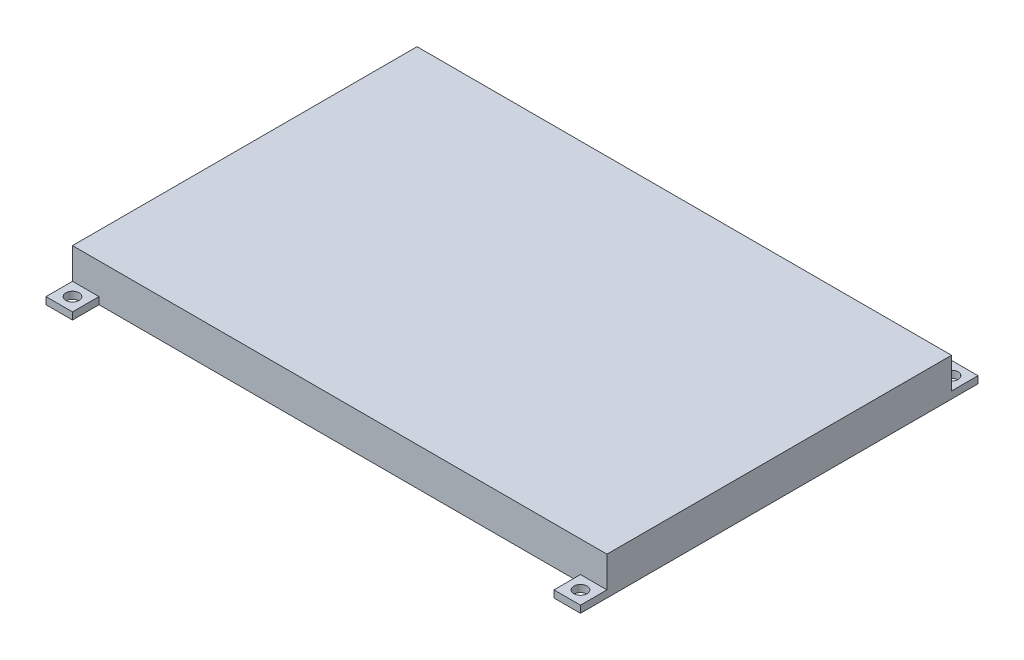
ISO-10303-21;
HEADER;
FILE_DESCRIPTION(('STEP AP214'),'2;1');
FILE_NAME('part.step','',(''),(''),'','','');
FILE_SCHEMA(('AUTOMOTIVE_DESIGN { 1 0 10303 214 1 1 1 1 }'));
ENDSEC;
DATA;
#1=APPLICATION_CONTEXT('core data for automotive mechanical design processes');
#2=APPLICATION_PROTOCOL_DEFINITION('international standard','automotive_design',2000,#1);
#3=PRODUCT_CONTEXT('',#1,'mechanical');
#4=PRODUCT('Part','Part','',(#3));
#5=PRODUCT_RELATED_PRODUCT_CATEGORY('part','',(#4));
#6=PRODUCT_DEFINITION_FORMATION('','',#4);
#7=PRODUCT_DEFINITION_CONTEXT('part definition',#1,'design');
#8=PRODUCT_DEFINITION('design','',#6,#7);
#9=PRODUCT_DEFINITION_SHAPE('','',#8);
#10=(LENGTH_UNIT() NAMED_UNIT(*) SI_UNIT(.MILLI.,.METRE.));
#11=(NAMED_UNIT(*) PLANE_ANGLE_UNIT() SI_UNIT($,.RADIAN.));
#12=(NAMED_UNIT(*) SI_UNIT($,.STERADIAN.) SOLID_ANGLE_UNIT());
#13=UNCERTAINTY_MEASURE_WITH_UNIT(LENGTH_MEASURE(1.E-05),#10,'distance_accuracy_value','');
#14=(GEOMETRIC_REPRESENTATION_CONTEXT(3) GLOBAL_UNCERTAINTY_ASSIGNED_CONTEXT((#13)) GLOBAL_UNIT_ASSIGNED_CONTEXT((#10,
#11,#12)) REPRESENTATION_CONTEXT('',''));
#15=CARTESIAN_POINT('',(0.,0.,0.));
#16=DIRECTION('',(0.,0.,1.));
#17=DIRECTION('',(1.,0.,0.));
#18=AXIS2_PLACEMENT_3D('',#15,#16,#17);
#19=CARTESIAN_POINT('',(0.,1.6,0.));
#20=DIRECTION('',(0.,-1.,0.));
#21=DIRECTION('',(0.,0.,-1.));
#22=AXIS2_PLACEMENT_3D('',#19,#20,#21);
#23=PLANE('',#22);
#24=CARTESIAN_POINT('',(-48.8422609717869,1.6,-61.1950025864503));
#25=DIRECTION('',(0.,1.,0.));
#26=DIRECTION('',(0.,0.,-1.));
#27=AXIS2_PLACEMENT_3D('',#24,#25,#26);
#28=CIRCLE('',#27,1.5);
#29=CARTESIAN_POINT('',(-48.8422609717869,1.6,-62.6950025864503));
#30=VERTEX_POINT('',#29);
#31=EDGE_CURVE('E190',#30,#30,#28,.T.);
#32=ORIENTED_EDGE('',*,*,#31,.F.);
#33=EDGE_LOOP('',(#32));
#34=FACE_BOUND('',#33,.T.);
#35=DIRECTION('',(-1.,0.,0.));
#36=VECTOR('',#35,1.);
#37=CARTESIAN_POINT('',(-166.842260971787,1.6,-58.1950025864503));
#38=LINE('',#37,#36);
#39=CARTESIAN_POINT('',(-45.8422609717865,1.6,-58.1950025864503));
#40=VERTEX_POINT('',#39);
#41=CARTESIAN_POINT('',(-51.8422609717869,1.6,-58.1950025864503));
#42=VERTEX_POINT('',#41);
#43=EDGE_CURVE('E44',#40,#42,#38,.T.);
#44=ORIENTED_EDGE('',*,*,#43,.F.);
#45=DIRECTION('',(0.,0.,-1.));
#46=VECTOR('',#45,1.);
#47=CARTESIAN_POINT('',(-45.8422609717869,1.6,19.8049974135498));
#48=LINE('',#47,#46);
#49=CARTESIAN_POINT('',(-45.8422609717869,1.6,-64.1950025864503));
#50=VERTEX_POINT('',#49);
#51=EDGE_CURVE('E205',#40,#50,#48,.T.);
#52=ORIENTED_EDGE('',*,*,#51,.T.);
#53=DIRECTION('',(-1.,0.,0.));
#54=VECTOR('',#53,1.);
#55=CARTESIAN_POINT('',(-51.8422609717869,1.6,-64.1950025864503));
#56=LINE('',#55,#54);
#57=CARTESIAN_POINT('',(-51.8422609717869,1.6,-64.1950025864503));
#58=VERTEX_POINT('',#57);
#59=EDGE_CURVE('E204',#50,#58,#56,.T.);
#60=ORIENTED_EDGE('',*,*,#59,.T.);
#61=DIRECTION('',(0.,0.,1.));
#62=VECTOR('',#61,1.);
#63=CARTESIAN_POINT('',(-51.8422609717869,1.6,-58.1950025864503));
#64=LINE('',#63,#62);
#65=EDGE_CURVE('E207',#58,#42,#64,.T.);
#66=ORIENTED_EDGE('',*,*,#65,.T.);
#67=EDGE_LOOP('',(#44,#52,#60,#66));
#68=FACE_BOUND('',#67,.T.);
#69=ADVANCED_FACE('F33',(#34,#68),#23,.F.);
#70=CARTESIAN_POINT('',(-163.842260971787,1.6,-61.1950025864502));
#71=DIRECTION('',(0.,1.,0.));
#72=DIRECTION('',(0.,0.,-1.));
#73=AXIS2_PLACEMENT_3D('',#70,#71,#72);
#74=CIRCLE('',#73,1.5);
#75=CARTESIAN_POINT('',(-163.842260971787,1.6,-62.6950025864502));
#76=VERTEX_POINT('',#75);
#77=EDGE_CURVE('E175',#76,#76,#74,.T.);
#78=ORIENTED_EDGE('',*,*,#77,.F.);
#79=EDGE_LOOP('',(#78));
#80=FACE_BOUND('',#79,.T.);
#81=CARTESIAN_POINT('',(-160.842260971787,1.6,-58.1950025864502));
#82=VERTEX_POINT('',#81);
#83=CARTESIAN_POINT('',(-166.842260971787,1.6,-58.1950025864503));
#84=VERTEX_POINT('',#83);
#85=EDGE_CURVE('E11',#82,#84,#38,.T.);
#86=ORIENTED_EDGE('',*,*,#85,.F.);
#87=DIRECTION('',(0.,0.,-1.));
#88=VECTOR('',#87,1.);
#89=CARTESIAN_POINT('',(-160.842260971787,1.6,-64.1950025864502));
#90=LINE('',#89,#88);
#91=CARTESIAN_POINT('',(-160.842260971787,1.6,-64.1950025864502));
#92=VERTEX_POINT('',#91);
#93=EDGE_CURVE('E209',#82,#92,#90,.T.);
#94=ORIENTED_EDGE('',*,*,#93,.T.);
#95=DIRECTION('',(-1.,0.,0.));
#96=VECTOR('',#95,1.);
#97=CARTESIAN_POINT('',(-166.842260971787,1.6,-64.1950025864502));
#98=LINE('',#97,#96);
#99=CARTESIAN_POINT('',(-166.842260971787,1.6,-64.1950025864502));
#100=VERTEX_POINT('',#99);
#101=EDGE_CURVE('E211',#92,#100,#98,.T.);
#102=ORIENTED_EDGE('',*,*,#101,.T.);
#103=DIRECTION('',(0.,0.,1.));
#104=VECTOR('',#103,1.);
#105=CARTESIAN_POINT('',(-166.842260971787,1.6,-58.1950025864503));
#106=LINE('',#105,#104);
#107=EDGE_CURVE('E59',#100,#84,#106,.T.);
#108=ORIENTED_EDGE('',*,*,#107,.T.);
#109=EDGE_LOOP('',(#86,#94,#102,#108));
#110=FACE_BOUND('',#109,.T.);
#111=ADVANCED_FACE('F317',(#80,#110),#23,.F.);
#112=CARTESIAN_POINT('',(-163.842260971787,1.6,22.8049974135498));
#113=DIRECTION('',(0.,1.,0.));
#114=DIRECTION('',(0.,0.,1.));
#115=AXIS2_PLACEMENT_3D('',#112,#113,#114);
#116=CIRCLE('',#115,1.5);
#117=CARTESIAN_POINT('',(-163.842260971787,1.6,24.3049974135498));
#118=VERTEX_POINT('',#117);
#119=EDGE_CURVE('E196',#118,#118,#116,.T.);
#120=ORIENTED_EDGE('',*,*,#119,.F.);
#121=EDGE_LOOP('',(#120));
#122=FACE_BOUND('',#121,.T.);
#123=DIRECTION('',(1.,0.,0.));
#124=VECTOR('',#123,1.);
#125=CARTESIAN_POINT('',(-166.842260971787,1.6,19.8049974135497));
#126=LINE('',#125,#124);
#127=CARTESIAN_POINT('',(-166.842260971787,1.6,19.8049974135497));
#128=VERTEX_POINT('',#127);
#129=CARTESIAN_POINT('',(-160.842260971787,1.6,19.8049974135497));
#130=VERTEX_POINT('',#129);
#131=EDGE_CURVE('E51',#128,#130,#126,.T.);
#132=ORIENTED_EDGE('',*,*,#131,.F.);
#133=CARTESIAN_POINT('',(-166.842260971787,1.6,25.8049974135497));
#134=VERTEX_POINT('',#133);
#135=EDGE_CURVE('E171',#128,#134,#106,.T.);
#136=ORIENTED_EDGE('',*,*,#135,.T.);
#137=DIRECTION('',(1.,0.,0.));
#138=VECTOR('',#137,1.);
#139=CARTESIAN_POINT('',(-160.842260971787,1.6,25.8049974135497));
#140=LINE('',#139,#138);
#141=CARTESIAN_POINT('',(-160.842260971787,1.6,25.8049974135497));
#142=VERTEX_POINT('',#141);
#143=EDGE_CURVE('E214',#134,#142,#140,.T.);
#144=ORIENTED_EDGE('',*,*,#143,.T.);
#145=DIRECTION('',(0.,0.,-1.));
#146=VECTOR('',#145,1.);
#147=CARTESIAN_POINT('',(-160.842260971787,1.6,19.8049974135497));
#148=LINE('',#147,#146);
#149=EDGE_CURVE('E216',#142,#130,#148,.T.);
#150=ORIENTED_EDGE('',*,*,#149,.T.);
#151=EDGE_LOOP('',(#132,#136,#144,#150));
#152=FACE_BOUND('',#151,.T.);
#153=ADVANCED_FACE('F343',(#122,#152),#23,.F.);
#154=CARTESIAN_POINT('',(-48.8422609717869,1.6,22.8049974135497));
#155=DIRECTION('',(0.,1.,0.));
#156=DIRECTION('',(0.,0.,1.));
#157=AXIS2_PLACEMENT_3D('',#154,#155,#156);
#158=CIRCLE('',#157,1.5);
#159=CARTESIAN_POINT('',(-48.8422609717869,1.6,24.3049974135497));
#160=VERTEX_POINT('',#159);
#161=EDGE_CURVE('E184',#160,#160,#158,.T.);
#162=ORIENTED_EDGE('',*,*,#161,.F.);
#163=EDGE_LOOP('',(#162));
#164=FACE_BOUND('',#163,.T.);
#165=CARTESIAN_POINT('',(-51.8422609717869,1.6,19.8049974135497));
#166=VERTEX_POINT('',#165);
#167=CARTESIAN_POINT('',(-45.8422609717869,1.6,19.8049974135497));
#168=VERTEX_POINT('',#167);
#169=EDGE_CURVE('E42',#166,#168,#126,.T.);
#170=ORIENTED_EDGE('',*,*,#169,.F.);
#171=DIRECTION('',(0.,0.,1.));
#172=VECTOR('',#171,1.);
#173=CARTESIAN_POINT('',(-51.8422609717869,1.6,25.8049974135497));
#174=LINE('',#173,#172);
#175=CARTESIAN_POINT('',(-51.8422609717869,1.6,25.8049974135497));
#176=VERTEX_POINT('',#175);
#177=EDGE_CURVE('E218',#166,#176,#174,.T.);
#178=ORIENTED_EDGE('',*,*,#177,.T.);
#179=DIRECTION('',(1.,0.,0.));
#180=VECTOR('',#179,1.);
#181=CARTESIAN_POINT('',(-45.8422609717869,1.6,25.8049974135497));
#182=LINE('',#181,#180);
#183=CARTESIAN_POINT('',(-45.8422609717869,1.6,25.8049974135497));
#184=VERTEX_POINT('',#183);
#185=EDGE_CURVE('E220',#176,#184,#182,.T.);
#186=ORIENTED_EDGE('',*,*,#185,.T.);
#187=EDGE_CURVE('E202',#184,#168,#48,.T.);
#188=ORIENTED_EDGE('',*,*,#187,.T.);
#189=EDGE_LOOP('',(#170,#178,#186,#188));
#190=FACE_BOUND('',#189,.T.);
#191=ADVANCED_FACE('F341',(#164,#190),#23,.F.);
#192=CARTESIAN_POINT('',(0.,0.,0.));
#193=DIRECTION('',(0.,-1.,0.));
#194=DIRECTION('',(0.,0.,-1.));
#195=AXIS2_PLACEMENT_3D('',#192,#193,#194);
#196=PLANE('',#195);
#197=CARTESIAN_POINT('',(-48.8422609717869,0.,22.8049974135497));
#198=DIRECTION('',(0.,1.,0.));
#199=DIRECTION('',(0.,0.,1.));
#200=AXIS2_PLACEMENT_3D('',#197,#198,#199);
#201=CIRCLE('',#200,1.5);
#202=CARTESIAN_POINT('',(-48.8422609717869,0.,24.3049974135497));
#203=VERTEX_POINT('',#202);
#204=EDGE_CURVE('E182',#203,#203,#201,.T.);
#205=ORIENTED_EDGE('',*,*,#204,.T.);
#206=EDGE_LOOP('',(#205));
#207=FACE_BOUND('',#206,.T.);
#208=CARTESIAN_POINT('',(-163.842260971787,0.,22.8049974135498));
#209=DIRECTION('',(0.,1.,0.));
#210=DIRECTION('',(0.,0.,1.));
#211=AXIS2_PLACEMENT_3D('',#208,#209,#210);
#212=CIRCLE('',#211,1.5);
#213=CARTESIAN_POINT('',(-163.842260971787,0.,24.3049974135498));
#214=VERTEX_POINT('',#213);
#215=EDGE_CURVE('E193',#214,#214,#212,.T.);
#216=ORIENTED_EDGE('',*,*,#215,.T.);
#217=EDGE_LOOP('',(#216));
#218=FACE_BOUND('',#217,.T.);
#219=DIRECTION('',(0.,0.,-1.));
#220=VECTOR('',#219,1.);
#221=CARTESIAN_POINT('',(-45.8422609717869,0.,-64.1950025864503));
#222=LINE('',#221,#220);
#223=CARTESIAN_POINT('',(-45.8422609717869,0.,25.8049974135497));
#224=VERTEX_POINT('',#223);
#225=CARTESIAN_POINT('',(-45.8422609717869,0.,-64.1950025864503));
#226=VERTEX_POINT('',#225);
#227=EDGE_CURVE('E199',#224,#226,#222,.T.);
#228=ORIENTED_EDGE('',*,*,#227,.F.);
#229=DIRECTION('',(1.,0.,0.));
#230=VECTOR('',#229,1.);
#231=CARTESIAN_POINT('',(-45.8422609717869,0.,25.8049974135497));
#232=LINE('',#231,#230);
#233=CARTESIAN_POINT('',(-51.8422609717869,0.,25.8049974135497));
#234=VERTEX_POINT('',#233);
#235=EDGE_CURVE('E245',#234,#224,#232,.T.);
#236=ORIENTED_EDGE('',*,*,#235,.F.);
#237=DIRECTION('',(0.,0.,1.));
#238=VECTOR('',#237,1.);
#239=CARTESIAN_POINT('',(-51.8422609717869,0.,25.8049974135497));
#240=LINE('',#239,#238);
#241=CARTESIAN_POINT('',(-51.8422609717869,0.,19.8049974135497));
#242=VERTEX_POINT('',#241);
#243=EDGE_CURVE('E243',#242,#234,#240,.T.);
#244=ORIENTED_EDGE('',*,*,#243,.F.);
#245=DIRECTION('',(1.,0.,0.));
#246=VECTOR('',#245,1.);
#247=CARTESIAN_POINT('',(-51.8422609717869,0.,19.8049974135497));
#248=LINE('',#247,#246);
#249=CARTESIAN_POINT('',(-160.842260971787,0.,19.8049974135497));
#250=VERTEX_POINT('',#249);
#251=EDGE_CURVE('E241',#250,#242,#248,.T.);
#252=ORIENTED_EDGE('',*,*,#251,.F.);
#253=DIRECTION('',(0.,0.,-1.));
#254=VECTOR('',#253,1.);
#255=CARTESIAN_POINT('',(-160.842260971787,0.,19.8049974135497));
#256=LINE('',#255,#254);
#257=CARTESIAN_POINT('',(-160.842260971787,0.,25.8049974135497));
#258=VERTEX_POINT('',#257);
#259=EDGE_CURVE('E239',#258,#250,#256,.T.);
#260=ORIENTED_EDGE('',*,*,#259,.F.);
#261=DIRECTION('',(1.,0.,0.));
#262=VECTOR('',#261,1.);
#263=CARTESIAN_POINT('',(-160.842260971787,0.,25.8049974135497));
#264=LINE('',#263,#262);
#265=CARTESIAN_POINT('',(-166.842260971787,0.,25.8049974135497));
#266=VERTEX_POINT('',#265);
#267=EDGE_CURVE('E237',#266,#258,#264,.T.);
#268=ORIENTED_EDGE('',*,*,#267,.F.);
#269=DIRECTION('',(0.,0.,1.));
#270=VECTOR('',#269,1.);
#271=CARTESIAN_POINT('',(-166.842260971787,0.,25.8049974135497));
#272=LINE('',#271,#270);
#273=CARTESIAN_POINT('',(-166.842260971787,0.,-64.1950025864502));
#274=VERTEX_POINT('',#273);
#275=EDGE_CURVE('E235',#274,#266,#272,.T.);
#276=ORIENTED_EDGE('',*,*,#275,.F.);
#277=DIRECTION('',(-1.,0.,0.));
#278=VECTOR('',#277,1.);
#279=CARTESIAN_POINT('',(-166.842260971787,0.,-64.1950025864502));
#280=LINE('',#279,#278);
#281=CARTESIAN_POINT('',(-160.842260971787,0.,-64.1950025864502));
#282=VERTEX_POINT('',#281);
#283=EDGE_CURVE('E232',#282,#274,#280,.T.);
#284=ORIENTED_EDGE('',*,*,#283,.F.);
#285=DIRECTION('',(0.,0.,-1.));
#286=VECTOR('',#285,1.);
#287=CARTESIAN_POINT('',(-160.842260971787,0.,-64.1950025864502));
#288=LINE('',#287,#286);
#289=CARTESIAN_POINT('',(-160.842260971787,0.,-58.1950025864502));
#290=VERTEX_POINT('',#289);
#291=EDGE_CURVE('E230',#290,#282,#288,.T.);
#292=ORIENTED_EDGE('',*,*,#291,.F.);
#293=DIRECTION('',(-1.,0.,0.));
#294=VECTOR('',#293,1.);
#295=CARTESIAN_POINT('',(-160.842260971787,0.,-58.1950025864502));
#296=LINE('',#295,#294);
#297=CARTESIAN_POINT('',(-51.8422609717869,0.,-58.1950025864503));
#298=VERTEX_POINT('',#297);
#299=EDGE_CURVE('E228',#298,#290,#296,.T.);
#300=ORIENTED_EDGE('',*,*,#299,.F.);
#301=DIRECTION('',(0.,0.,1.));
#302=VECTOR('',#301,1.);
#303=CARTESIAN_POINT('',(-51.8422609717869,0.,-58.1950025864503));
#304=LINE('',#303,#302);
#305=CARTESIAN_POINT('',(-51.8422609717869,0.,-64.1950025864503));
#306=VERTEX_POINT('',#305);
#307=EDGE_CURVE('E226',#306,#298,#304,.T.);
#308=ORIENTED_EDGE('',*,*,#307,.F.);
#309=DIRECTION('',(-1.,0.,0.));
#310=VECTOR('',#309,1.);
#311=CARTESIAN_POINT('',(-51.8422609717869,0.,-64.1950025864503));
#312=LINE('',#311,#310);
#313=EDGE_CURVE('E224',#226,#306,#312,.T.);
#314=ORIENTED_EDGE('',*,*,#313,.F.);
#315=EDGE_LOOP('',(#228,#236,#244,#252,#260,#268,#276,#284,#292,#300,#308,#314));
#316=FACE_BOUND('',#315,.T.);
#317=CARTESIAN_POINT('',(-48.8422609717869,0.,-61.1950025864503));
#318=DIRECTION('',(0.,1.,0.));
#319=DIRECTION('',(0.,0.,-1.));
#320=AXIS2_PLACEMENT_3D('',#317,#318,#319);
#321=CIRCLE('',#320,1.5);
#322=CARTESIAN_POINT('',(-48.8422609717869,0.,-62.6950025864503));
#323=VERTEX_POINT('',#322);
#324=EDGE_CURVE('E187',#323,#323,#321,.T.);
#325=ORIENTED_EDGE('',*,*,#324,.T.);
#326=EDGE_LOOP('',(#325));
#327=FACE_BOUND('',#326,.T.);
#328=CARTESIAN_POINT('',(-163.842260971787,0.,-61.1950025864502));
#329=DIRECTION('',(0.,1.,0.));
#330=DIRECTION('',(0.,0.,-1.));
#331=AXIS2_PLACEMENT_3D('',#328,#329,#330);
#332=CIRCLE('',#331,1.5);
#333=CARTESIAN_POINT('',(-163.842260971787,0.,-62.6950025864502));
#334=VERTEX_POINT('',#333);
#335=EDGE_CURVE('E172',#334,#334,#332,.T.);
#336=ORIENTED_EDGE('',*,*,#335,.T.);
#337=EDGE_LOOP('',(#336));
#338=FACE_BOUND('',#337,.T.);
#339=ADVANCED_FACE('F306',(#207,#218,#316,#327,#338),#196,.T.);
#340=CARTESIAN_POINT('',(-45.8422609717869,1.6,-64.1950025864503));
#341=DIRECTION('',(-1.,0.,0.));
#342=DIRECTION('',(0.,0.,1.));
#343=AXIS2_PLACEMENT_3D('',#340,#341,#342);
#344=PLANE('',#343);
#345=ORIENTED_EDGE('',*,*,#227,.T.);
#346=DIRECTION('',(0.,-1.,0.));
#347=VECTOR('',#346,1.);
#348=CARTESIAN_POINT('',(-45.8422609717869,1.6,-64.1950025864503));
#349=LINE('',#348,#347);
#350=EDGE_CURVE('E37',#50,#226,#349,.T.);
#351=ORIENTED_EDGE('',*,*,#350,.F.);
#352=ORIENTED_EDGE('',*,*,#51,.F.);
#353=DIRECTION('',(0.,-1.,0.));
#354=VECTOR('',#353,1.);
#355=CARTESIAN_POINT('',(-45.8422609717869,8.6,-58.1950025864503));
#356=LINE('',#355,#354);
#357=CARTESIAN_POINT('',(-45.8422609717869,8.6,-58.1950025864503));
#358=VERTEX_POINT('',#357);
#359=EDGE_CURVE('E177',#358,#40,#356,.T.);
#360=ORIENTED_EDGE('',*,*,#359,.F.);
#361=DIRECTION('',(0.,0.,-1.));
#362=VECTOR('',#361,1.);
#363=CARTESIAN_POINT('',(-45.8422609717869,8.6,-58.1950025864503));
#364=LINE('',#363,#362);
#365=CARTESIAN_POINT('',(-45.8422609717869,8.6,19.8049974135497));
#366=VERTEX_POINT('',#365);
#367=EDGE_CURVE('E158',#366,#358,#364,.T.);
#368=ORIENTED_EDGE('',*,*,#367,.F.);
#369=DIRECTION('',(0.,-1.,0.));
#370=VECTOR('',#369,1.);
#371=CARTESIAN_POINT('',(-45.8422609717869,8.6,19.8049974135497));
#372=LINE('',#371,#370);
#373=EDGE_CURVE('E155',#366,#168,#372,.T.);
#374=ORIENTED_EDGE('',*,*,#373,.T.);
#375=ORIENTED_EDGE('',*,*,#187,.F.);
#376=DIRECTION('',(0.,-1.,0.));
#377=VECTOR('',#376,1.);
#378=CARTESIAN_POINT('',(-45.8422609717869,1.6,25.8049974135497));
#379=LINE('',#378,#377);
#380=EDGE_CURVE('E222',#184,#224,#379,.T.);
#381=ORIENTED_EDGE('',*,*,#380,.T.);
#382=EDGE_LOOP('',(#345,#351,#352,#360,#368,#374,#375,#381));
#383=FACE_BOUND('',#382,.T.);
#384=ADVANCED_FACE('F35',(#383),#344,.F.);
#385=CARTESIAN_POINT('',(-51.8422609717869,1.6,-64.1950025864503));
#386=DIRECTION('',(0.,0.,1.));
#387=DIRECTION('',(1.,0.,0.));
#388=AXIS2_PLACEMENT_3D('',#385,#386,#387);
#389=PLANE('',#388);
#390=ORIENTED_EDGE('',*,*,#313,.T.);
#391=DIRECTION('',(0.,-1.,0.));
#392=VECTOR('',#391,1.);
#393=CARTESIAN_POINT('',(-51.8422609717869,1.6,-64.1950025864503));
#394=LINE('',#393,#392);
#395=EDGE_CURVE('E276',#58,#306,#394,.T.);
#396=ORIENTED_EDGE('',*,*,#395,.F.);
#397=ORIENTED_EDGE('',*,*,#59,.F.);
#398=ORIENTED_EDGE('',*,*,#350,.T.);
#399=EDGE_LOOP('',(#390,#396,#397,#398));
#400=FACE_BOUND('',#399,.T.);
#401=ADVANCED_FACE('F414',(#400),#389,.F.);
#402=CARTESIAN_POINT('',(-51.8422609717869,1.6,-58.1950025864503));
#403=DIRECTION('',(1.,0.,0.));
#404=DIRECTION('',(0.,0.,-1.));
#405=AXIS2_PLACEMENT_3D('',#402,#403,#404);
#406=PLANE('',#405);
#407=ORIENTED_EDGE('',*,*,#307,.T.);
#408=DIRECTION('',(0.,-1.,0.));
#409=VECTOR('',#408,1.);
#410=CARTESIAN_POINT('',(-51.8422609717869,1.6,-58.1950025864503));
#411=LINE('',#410,#409);
#412=EDGE_CURVE('E274',#42,#298,#411,.T.);
#413=ORIENTED_EDGE('',*,*,#412,.F.);
#414=ORIENTED_EDGE('',*,*,#65,.F.);
#415=ORIENTED_EDGE('',*,*,#395,.T.);
#416=EDGE_LOOP('',(#407,#413,#414,#415));
#417=FACE_BOUND('',#416,.T.);
#418=ADVANCED_FACE('F301',(#417),#406,.F.);
#419=CARTESIAN_POINT('',(-160.842260971787,1.6,-58.1950025864502));
#420=DIRECTION('',(0.,0.,1.));
#421=DIRECTION('',(1.,0.,0.));
#422=AXIS2_PLACEMENT_3D('',#419,#420,#421);
#423=PLANE('',#422);
#424=ORIENTED_EDGE('',*,*,#299,.T.);
#425=DIRECTION('',(0.,-1.,0.));
#426=VECTOR('',#425,1.);
#427=CARTESIAN_POINT('',(-160.842260971787,1.6,-58.1950025864502));
#428=LINE('',#427,#426);
#429=EDGE_CURVE('E271',#82,#290,#428,.T.);
#430=ORIENTED_EDGE('',*,*,#429,.F.);
#431=ORIENTED_EDGE('',*,*,#85,.T.);
#432=DIRECTION('',(0.,-1.,0.));
#433=VECTOR('',#432,1.);
#434=CARTESIAN_POINT('',(-166.842260971787,8.6,-58.1950025864503));
#435=LINE('',#434,#433);
#436=CARTESIAN_POINT('',(-166.842260971787,8.6,-58.1950025864503));
#437=VERTEX_POINT('',#436);
#438=EDGE_CURVE('E294',#437,#84,#435,.T.);
#439=ORIENTED_EDGE('',*,*,#438,.F.);
#440=DIRECTION('',(-1.,0.,0.));
#441=VECTOR('',#440,1.);
#442=CARTESIAN_POINT('',(-166.842260971787,8.6,-58.1950025864503));
#443=LINE('',#442,#441);
#444=EDGE_CURVE('E164',#358,#437,#443,.T.);
#445=ORIENTED_EDGE('',*,*,#444,.F.);
#446=ORIENTED_EDGE('',*,*,#359,.T.);
#447=ORIENTED_EDGE('',*,*,#43,.T.);
#448=ORIENTED_EDGE('',*,*,#412,.T.);
#449=EDGE_LOOP('',(#424,#430,#431,#439,#445,#446,#447,#448));
#450=FACE_BOUND('',#449,.T.);
#451=ADVANCED_FACE('F296',(#450),#423,.F.);
#452=CARTESIAN_POINT('',(-160.842260971787,1.6,-64.1950025864502));
#453=DIRECTION('',(-1.,0.,0.));
#454=DIRECTION('',(0.,0.,1.));
#455=AXIS2_PLACEMENT_3D('',#452,#453,#454);
#456=PLANE('',#455);
#457=ORIENTED_EDGE('',*,*,#291,.T.);
#458=DIRECTION('',(0.,-1.,0.));
#459=VECTOR('',#458,1.);
#460=CARTESIAN_POINT('',(-160.842260971787,1.6,-64.1950025864502));
#461=LINE('',#460,#459);
#462=EDGE_CURVE('E268',#92,#282,#461,.T.);
#463=ORIENTED_EDGE('',*,*,#462,.F.);
#464=ORIENTED_EDGE('',*,*,#93,.F.);
#465=ORIENTED_EDGE('',*,*,#429,.T.);
#466=EDGE_LOOP('',(#457,#463,#464,#465));
#467=FACE_BOUND('',#466,.T.);
#468=ADVANCED_FACE('F311',(#467),#456,.F.);
#469=CARTESIAN_POINT('',(-166.842260971787,1.6,-64.1950025864502));
#470=DIRECTION('',(0.,0.,1.));
#471=DIRECTION('',(1.,0.,0.));
#472=AXIS2_PLACEMENT_3D('',#469,#470,#471);
#473=PLANE('',#472);
#474=ORIENTED_EDGE('',*,*,#283,.T.);
#475=DIRECTION('',(0.,-1.,0.));
#476=VECTOR('',#475,1.);
#477=CARTESIAN_POINT('',(-166.842260971787,1.6,-64.1950025864502));
#478=LINE('',#477,#476);
#479=EDGE_CURVE('E265',#100,#274,#478,.T.);
#480=ORIENTED_EDGE('',*,*,#479,.F.);
#481=ORIENTED_EDGE('',*,*,#101,.F.);
#482=ORIENTED_EDGE('',*,*,#462,.T.);
#483=EDGE_LOOP('',(#474,#480,#481,#482));
#484=FACE_BOUND('',#483,.T.);
#485=ADVANCED_FACE('F315',(#484),#473,.F.);
#486=CARTESIAN_POINT('',(-166.842260971787,1.6,25.8049974135497));
#487=DIRECTION('',(1.,0.,0.));
#488=DIRECTION('',(0.,0.,-1.));
#489=AXIS2_PLACEMENT_3D('',#486,#487,#488);
#490=PLANE('',#489);
#491=ORIENTED_EDGE('',*,*,#275,.T.);
#492=DIRECTION('',(0.,-1.,0.));
#493=VECTOR('',#492,1.);
#494=CARTESIAN_POINT('',(-166.842260971787,1.6,25.8049974135497));
#495=LINE('',#494,#493);
#496=EDGE_CURVE('E262',#134,#266,#495,.T.);
#497=ORIENTED_EDGE('',*,*,#496,.F.);
#498=ORIENTED_EDGE('',*,*,#135,.F.);
#499=DIRECTION('',(0.,-1.,0.));
#500=VECTOR('',#499,1.);
#501=CARTESIAN_POINT('',(-166.842260971787,8.6,19.8049974135497));
#502=LINE('',#501,#500);
#503=CARTESIAN_POINT('',(-166.842260971787,8.6,19.8049974135497));
#504=VERTEX_POINT('',#503);
#505=EDGE_CURVE('E152',#504,#128,#502,.T.);
#506=ORIENTED_EDGE('',*,*,#505,.F.);
#507=DIRECTION('',(0.,0.,1.));
#508=VECTOR('',#507,1.);
#509=CARTESIAN_POINT('',(-166.842260971787,8.6,-58.1950025864503));
#510=LINE('',#509,#508);
#511=EDGE_CURVE('E159',#437,#504,#510,.T.);
#512=ORIENTED_EDGE('',*,*,#511,.F.);
#513=ORIENTED_EDGE('',*,*,#438,.T.);
#514=ORIENTED_EDGE('',*,*,#107,.F.);
#515=ORIENTED_EDGE('',*,*,#479,.T.);
#516=EDGE_LOOP('',(#491,#497,#498,#506,#512,#513,#514,#515));
#517=FACE_BOUND('',#516,.T.);
#518=ADVANCED_FACE('F169',(#517),#490,.F.);
#519=CARTESIAN_POINT('',(-160.842260971787,1.6,25.8049974135497));
#520=DIRECTION('',(0.,0.,-1.));
#521=DIRECTION('',(-1.,0.,0.));
#522=AXIS2_PLACEMENT_3D('',#519,#520,#521);
#523=PLANE('',#522);
#524=ORIENTED_EDGE('',*,*,#267,.T.);
#525=DIRECTION('',(0.,-1.,0.));
#526=VECTOR('',#525,1.);
#527=CARTESIAN_POINT('',(-160.842260971787,1.6,25.8049974135497));
#528=LINE('',#527,#526);
#529=EDGE_CURVE('E259',#142,#258,#528,.T.);
#530=ORIENTED_EDGE('',*,*,#529,.F.);
#531=ORIENTED_EDGE('',*,*,#143,.F.);
#532=ORIENTED_EDGE('',*,*,#496,.T.);
#533=EDGE_LOOP('',(#524,#530,#531,#532));
#534=FACE_BOUND('',#533,.T.);
#535=ADVANCED_FACE('F321',(#534),#523,.F.);
#536=CARTESIAN_POINT('',(-160.842260971787,1.6,19.8049974135497));
#537=DIRECTION('',(-1.,0.,0.));
#538=DIRECTION('',(0.,0.,1.));
#539=AXIS2_PLACEMENT_3D('',#536,#537,#538);
#540=PLANE('',#539);
#541=ORIENTED_EDGE('',*,*,#259,.T.);
#542=DIRECTION('',(0.,-1.,0.));
#543=VECTOR('',#542,1.);
#544=CARTESIAN_POINT('',(-160.842260971787,1.6,19.8049974135497));
#545=LINE('',#544,#543);
#546=EDGE_CURVE('E256',#130,#250,#545,.T.);
#547=ORIENTED_EDGE('',*,*,#546,.F.);
#548=ORIENTED_EDGE('',*,*,#149,.F.);
#549=ORIENTED_EDGE('',*,*,#529,.T.);
#550=EDGE_LOOP('',(#541,#547,#548,#549));
#551=FACE_BOUND('',#550,.T.);
#552=ADVANCED_FACE('F328',(#551),#540,.F.);
#553=CARTESIAN_POINT('',(-51.8422609717869,1.6,19.8049974135497));
#554=DIRECTION('',(0.,0.,-1.));
#555=DIRECTION('',(-1.,0.,0.));
#556=AXIS2_PLACEMENT_3D('',#553,#554,#555);
#557=PLANE('',#556);
#558=ORIENTED_EDGE('',*,*,#251,.T.);
#559=DIRECTION('',(0.,-1.,0.));
#560=VECTOR('',#559,1.);
#561=CARTESIAN_POINT('',(-51.8422609717869,1.6,19.8049974135497));
#562=LINE('',#561,#560);
#563=EDGE_CURVE('E253',#166,#242,#562,.T.);
#564=ORIENTED_EDGE('',*,*,#563,.F.);
#565=ORIENTED_EDGE('',*,*,#169,.T.);
#566=ORIENTED_EDGE('',*,*,#373,.F.);
#567=DIRECTION('',(1.,0.,0.));
#568=VECTOR('',#567,1.);
#569=CARTESIAN_POINT('',(-166.842260971787,8.6,19.8049974135497));
#570=LINE('',#569,#568);
#571=EDGE_CURVE('E148',#504,#366,#570,.T.);
#572=ORIENTED_EDGE('',*,*,#571,.F.);
#573=ORIENTED_EDGE('',*,*,#505,.T.);
#574=ORIENTED_EDGE('',*,*,#131,.T.);
#575=ORIENTED_EDGE('',*,*,#546,.T.);
#576=EDGE_LOOP('',(#558,#564,#565,#566,#572,#573,#574,#575));
#577=FACE_BOUND('',#576,.T.);
#578=ADVANCED_FACE('F150',(#577),#557,.F.);
#579=CARTESIAN_POINT('',(-51.8422609717869,1.6,25.8049974135497));
#580=DIRECTION('',(1.,0.,0.));
#581=DIRECTION('',(0.,0.,-1.));
#582=AXIS2_PLACEMENT_3D('',#579,#580,#581);
#583=PLANE('',#582);
#584=ORIENTED_EDGE('',*,*,#243,.T.);
#585=DIRECTION('',(0.,-1.,0.));
#586=VECTOR('',#585,1.);
#587=CARTESIAN_POINT('',(-51.8422609717869,1.6,25.8049974135497));
#588=LINE('',#587,#586);
#589=EDGE_CURVE('E250',#176,#234,#588,.T.);
#590=ORIENTED_EDGE('',*,*,#589,.F.);
#591=ORIENTED_EDGE('',*,*,#177,.F.);
#592=ORIENTED_EDGE('',*,*,#563,.T.);
#593=EDGE_LOOP('',(#584,#590,#591,#592));
#594=FACE_BOUND('',#593,.T.);
#595=ADVANCED_FACE('F332',(#594),#583,.F.);
#596=CARTESIAN_POINT('',(-45.8422609717869,1.6,25.8049974135497));
#597=DIRECTION('',(0.,0.,-1.));
#598=DIRECTION('',(-1.,0.,0.));
#599=AXIS2_PLACEMENT_3D('',#596,#597,#598);
#600=PLANE('',#599);
#601=ORIENTED_EDGE('',*,*,#235,.T.);
#602=ORIENTED_EDGE('',*,*,#380,.F.);
#603=ORIENTED_EDGE('',*,*,#185,.F.);
#604=ORIENTED_EDGE('',*,*,#589,.T.);
#605=EDGE_LOOP('',(#601,#602,#603,#604));
#606=FACE_BOUND('',#605,.T.);
#607=ADVANCED_FACE('F337',(#606),#600,.F.);
#608=CARTESIAN_POINT('',(-163.842260971787,1.6,22.8049974135498));
#609=DIRECTION('',(0.,-1.,0.));
#610=DIRECTION('',(0.,0.,-1.));
#611=AXIS2_PLACEMENT_3D('',#608,#609,#610);
#612=CYLINDRICAL_SURFACE('',#611,1.5);
#613=ORIENTED_EDGE('',*,*,#119,.T.);
#614=EDGE_LOOP('',(#613));
#615=FACE_BOUND('',#614,.T.);
#616=ORIENTED_EDGE('',*,*,#215,.F.);
#617=EDGE_LOOP('',(#616));
#618=FACE_BOUND('',#617,.T.);
#619=ADVANCED_FACE('F367',(#615,#618),#612,.F.);
#620=CARTESIAN_POINT('',(-48.8422609717869,1.6,-61.1950025864503));
#621=DIRECTION('',(0.,-1.,0.));
#622=DIRECTION('',(0.,0.,-1.));
#623=AXIS2_PLACEMENT_3D('',#620,#621,#622);
#624=CYLINDRICAL_SURFACE('',#623,1.5);
#625=ORIENTED_EDGE('',*,*,#31,.T.);
#626=EDGE_LOOP('',(#625));
#627=FACE_BOUND('',#626,.T.);
#628=ORIENTED_EDGE('',*,*,#324,.F.);
#629=EDGE_LOOP('',(#628));
#630=FACE_BOUND('',#629,.T.);
#631=ADVANCED_FACE('F363',(#627,#630),#624,.F.);
#632=CARTESIAN_POINT('',(-48.8422609717869,1.6,22.8049974135497));
#633=DIRECTION('',(0.,-1.,0.));
#634=DIRECTION('',(0.,0.,-1.));
#635=AXIS2_PLACEMENT_3D('',#632,#633,#634);
#636=CYLINDRICAL_SURFACE('',#635,1.5);
#637=ORIENTED_EDGE('',*,*,#161,.T.);
#638=EDGE_LOOP('',(#637));
#639=FACE_BOUND('',#638,.T.);
#640=ORIENTED_EDGE('',*,*,#204,.F.);
#641=EDGE_LOOP('',(#640));
#642=FACE_BOUND('',#641,.T.);
#643=ADVANCED_FACE('F366',(#639,#642),#636,.F.);
#644=CARTESIAN_POINT('',(-163.842260971787,1.6,-61.1950025864502));
#645=DIRECTION('',(0.,-1.,0.));
#646=DIRECTION('',(0.,0.,-1.));
#647=AXIS2_PLACEMENT_3D('',#644,#645,#646);
#648=CYLINDRICAL_SURFACE('',#647,1.5);
#649=ORIENTED_EDGE('',*,*,#77,.T.);
#650=EDGE_LOOP('',(#649));
#651=FACE_BOUND('',#650,.T.);
#652=ORIENTED_EDGE('',*,*,#335,.F.);
#653=EDGE_LOOP('',(#652));
#654=FACE_BOUND('',#653,.T.);
#655=ADVANCED_FACE('F373',(#651,#654),#648,.F.);
#656=CARTESIAN_POINT('',(0.,8.6,0.));
#657=DIRECTION('',(0.,1.,0.));
#658=DIRECTION('',(0.,0.,1.));
#659=AXIS2_PLACEMENT_3D('',#656,#657,#658);
#660=PLANE('',#659);
#661=ORIENTED_EDGE('',*,*,#511,.T.);
#662=ORIENTED_EDGE('',*,*,#571,.T.);
#663=ORIENTED_EDGE('',*,*,#367,.T.);
#664=ORIENTED_EDGE('',*,*,#444,.T.);
#665=EDGE_LOOP('',(#661,#662,#663,#664));
#666=FACE_BOUND('',#665,.T.);
#667=ADVANCED_FACE('F162',(#666),#660,.T.);
#668=CLOSED_SHELL('',(#69,#111,#153,#191,#339,#384,#401,#418,#451,#468,#485,#518,#535,#552,#578,
#595,#607,#619,#631,#643,#655,#667));
#669=MANIFOLD_SOLID_BREP('B2',#668);
#670=ADVANCED_BREP_SHAPE_REPRESENTATION('',(#18,#669),#14);
#671=SHAPE_DEFINITION_REPRESENTATION(#9,#670);
ENDSEC;
END-ISO-10303-21;
